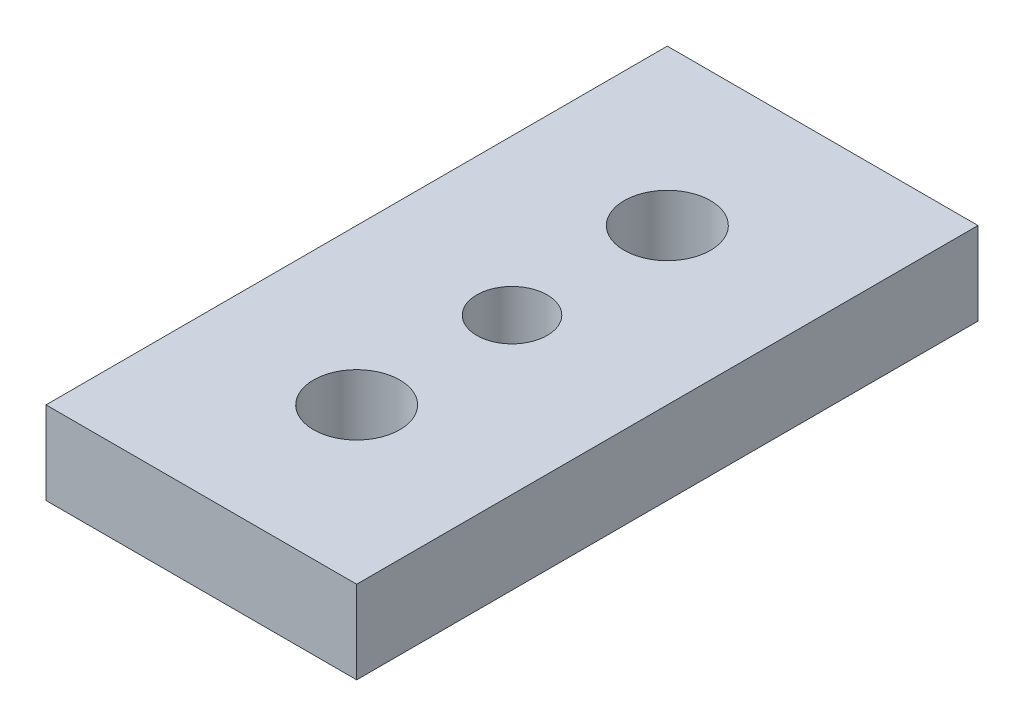
ISO-10303-21;
HEADER;
FILE_DESCRIPTION(('STEP AP214'),'2;1');
FILE_NAME('part.step','',(''),(''),'','','');
FILE_SCHEMA(('AUTOMOTIVE_DESIGN { 1 0 10303 214 1 1 1 1 }'));
ENDSEC;
DATA;
#1=APPLICATION_CONTEXT('core data for automotive mechanical design processes');
#2=APPLICATION_PROTOCOL_DEFINITION('international standard','automotive_design',2000,#1);
#3=PRODUCT_CONTEXT('',#1,'mechanical');
#4=PRODUCT('Part','Part','',(#3));
#5=PRODUCT_RELATED_PRODUCT_CATEGORY('part','',(#4));
#6=PRODUCT_DEFINITION_FORMATION('','',#4);
#7=PRODUCT_DEFINITION_CONTEXT('part definition',#1,'design');
#8=PRODUCT_DEFINITION('design','',#6,#7);
#9=PRODUCT_DEFINITION_SHAPE('','',#8);
#10=(LENGTH_UNIT() NAMED_UNIT(*) SI_UNIT(.MILLI.,.METRE.));
#11=(NAMED_UNIT(*) PLANE_ANGLE_UNIT() SI_UNIT($,.RADIAN.));
#12=(NAMED_UNIT(*) SI_UNIT($,.STERADIAN.) SOLID_ANGLE_UNIT());
#13=UNCERTAINTY_MEASURE_WITH_UNIT(LENGTH_MEASURE(1.E-05),#10,'distance_accuracy_value','');
#14=(GEOMETRIC_REPRESENTATION_CONTEXT(3) GLOBAL_UNCERTAINTY_ASSIGNED_CONTEXT((#13)) GLOBAL_UNIT_ASSIGNED_CONTEXT((#10,
#11,#12)) REPRESENTATION_CONTEXT('',''));
#15=CARTESIAN_POINT('',(0.,0.,0.));
#16=DIRECTION('',(0.,0.,1.));
#17=DIRECTION('',(1.,0.,0.));
#18=AXIS2_PLACEMENT_3D('',#15,#16,#17);
#19=CARTESIAN_POINT('',(0.,12.,0.));
#20=DIRECTION('',(0.,1.,0.));
#21=DIRECTION('',(0.,0.,1.));
#22=AXIS2_PLACEMENT_3D('',#19,#20,#21);
#23=PLANE('',#22);
#24=CARTESIAN_POINT('',(22.5,12.,-45.));
#25=DIRECTION('',(0.,1.,0.));
#26=DIRECTION('',(0.,0.,1.));
#27=AXIS2_PLACEMENT_3D('',#24,#25,#26);
#28=CIRCLE('',#27,5.1);
#29=CARTESIAN_POINT('',(22.5,12.,-39.9));
#30=VERTEX_POINT('',#29);
#31=EDGE_CURVE('E129',#30,#30,#28,.T.);
#32=ORIENTED_EDGE('',*,*,#31,.F.);
#33=EDGE_LOOP('',(#32));
#34=FACE_BOUND('',#33,.T.);
#35=CARTESIAN_POINT('',(22.5,12.,-67.5));
#36=DIRECTION('',(0.,1.,0.));
#37=DIRECTION('',(0.,0.,1.));
#38=AXIS2_PLACEMENT_3D('',#35,#36,#37);
#39=CIRCLE('',#38,6.25);
#40=CARTESIAN_POINT('',(22.5,12.,-61.25));
#41=VERTEX_POINT('',#40);
#42=EDGE_CURVE('E103',#41,#41,#39,.T.);
#43=ORIENTED_EDGE('',*,*,#42,.F.);
#44=EDGE_LOOP('',(#43));
#45=FACE_BOUND('',#44,.T.);
#46=DIRECTION('',(0.,0.,1.));
#47=VECTOR('',#46,1.);
#48=CARTESIAN_POINT('',(0.,12.,-90.));
#49=LINE('',#48,#47);
#50=CARTESIAN_POINT('',(0.,12.,-90.));
#51=VERTEX_POINT('',#50);
#52=CARTESIAN_POINT('',(0.,12.,0.));
#53=VERTEX_POINT('',#52);
#54=EDGE_CURVE('E88',#51,#53,#49,.T.);
#55=ORIENTED_EDGE('',*,*,#54,.T.);
#56=DIRECTION('',(1.,0.,0.));
#57=VECTOR('',#56,1.);
#58=CARTESIAN_POINT('',(0.,12.,0.));
#59=LINE('',#58,#57);
#60=CARTESIAN_POINT('',(45.,12.,0.));
#61=VERTEX_POINT('',#60);
#62=EDGE_CURVE('E83',#53,#61,#59,.T.);
#63=ORIENTED_EDGE('',*,*,#62,.T.);
#64=DIRECTION('',(0.,0.,-1.));
#65=VECTOR('',#64,1.);
#66=CARTESIAN_POINT('',(45.,12.,0.));
#67=LINE('',#66,#65);
#68=CARTESIAN_POINT('',(45.,12.,-90.));
#69=VERTEX_POINT('',#68);
#70=EDGE_CURVE('E86',#61,#69,#67,.T.);
#71=ORIENTED_EDGE('',*,*,#70,.T.);
#72=DIRECTION('',(-1.,0.,0.));
#73=VECTOR('',#72,1.);
#74=CARTESIAN_POINT('',(45.,12.,-90.));
#75=LINE('',#74,#73);
#76=EDGE_CURVE('E53',#69,#51,#75,.T.);
#77=ORIENTED_EDGE('',*,*,#76,.T.);
#78=EDGE_LOOP('',(#55,#63,#71,#77));
#79=FACE_BOUND('',#78,.T.);
#80=CARTESIAN_POINT('',(22.5,12.,-22.5));
#81=DIRECTION('',(0.,1.,0.));
#82=DIRECTION('',(0.,0.,1.));
#83=AXIS2_PLACEMENT_3D('',#80,#81,#82);
#84=CIRCLE('',#83,6.25);
#85=CARTESIAN_POINT('',(22.5,12.,-16.25));
#86=VERTEX_POINT('',#85);
#87=EDGE_CURVE('E118',#86,#86,#84,.T.);
#88=ORIENTED_EDGE('',*,*,#87,.F.);
#89=EDGE_LOOP('',(#88));
#90=FACE_BOUND('',#89,.T.);
#91=ADVANCED_FACE('F36',(#34,#45,#79,#90),#23,.T.);
#92=CARTESIAN_POINT('',(0.,0.,0.));
#93=DIRECTION('',(0.,1.,0.));
#94=DIRECTION('',(0.,0.,1.));
#95=AXIS2_PLACEMENT_3D('',#92,#93,#94);
#96=PLANE('',#95);
#97=CARTESIAN_POINT('',(22.5,0.,-45.));
#98=DIRECTION('',(0.,1.,0.));
#99=DIRECTION('',(0.,0.,1.));
#100=AXIS2_PLACEMENT_3D('',#97,#98,#99);
#101=CIRCLE('',#100,5.1);
#102=CARTESIAN_POINT('',(22.5,0.,-39.9));
#103=VERTEX_POINT('',#102);
#104=EDGE_CURVE('E124',#103,#103,#101,.T.);
#105=ORIENTED_EDGE('',*,*,#104,.T.);
#106=EDGE_LOOP('',(#105));
#107=FACE_BOUND('',#106,.T.);
#108=CARTESIAN_POINT('',(22.5,0.,-67.5));
#109=DIRECTION('',(0.,1.,0.));
#110=DIRECTION('',(0.,0.,1.));
#111=AXIS2_PLACEMENT_3D('',#108,#109,#110);
#112=CIRCLE('',#111,6.25);
#113=CARTESIAN_POINT('',(22.5,0.,-61.25));
#114=VERTEX_POINT('',#113);
#115=EDGE_CURVE('E115',#114,#114,#112,.T.);
#116=ORIENTED_EDGE('',*,*,#115,.T.);
#117=EDGE_LOOP('',(#116));
#118=FACE_BOUND('',#117,.T.);
#119=DIRECTION('',(0.,0.,1.));
#120=VECTOR('',#119,1.);
#121=CARTESIAN_POINT('',(0.,0.,-90.));
#122=LINE('',#121,#120);
#123=CARTESIAN_POINT('',(0.,0.,-90.));
#124=VERTEX_POINT('',#123);
#125=CARTESIAN_POINT('',(0.,0.,0.));
#126=VERTEX_POINT('',#125);
#127=EDGE_CURVE('E100',#124,#126,#122,.T.);
#128=ORIENTED_EDGE('',*,*,#127,.F.);
#129=DIRECTION('',(-1.,0.,0.));
#130=VECTOR('',#129,1.);
#131=CARTESIAN_POINT('',(45.,0.,-90.));
#132=LINE('',#131,#130);
#133=CARTESIAN_POINT('',(45.,0.,-90.));
#134=VERTEX_POINT('',#133);
#135=EDGE_CURVE('E76',#134,#124,#132,.T.);
#136=ORIENTED_EDGE('',*,*,#135,.F.);
#137=DIRECTION('',(0.,0.,-1.));
#138=VECTOR('',#137,1.);
#139=CARTESIAN_POINT('',(45.,0.,0.));
#140=LINE('',#139,#138);
#141=CARTESIAN_POINT('',(45.,0.,0.));
#142=VERTEX_POINT('',#141);
#143=EDGE_CURVE('E70',#142,#134,#140,.T.);
#144=ORIENTED_EDGE('',*,*,#143,.F.);
#145=DIRECTION('',(1.,0.,0.));
#146=VECTOR('',#145,1.);
#147=CARTESIAN_POINT('',(0.,0.,0.));
#148=LINE('',#147,#146);
#149=EDGE_CURVE('E92',#126,#142,#148,.T.);
#150=ORIENTED_EDGE('',*,*,#149,.F.);
#151=EDGE_LOOP('',(#128,#136,#144,#150));
#152=FACE_BOUND('',#151,.T.);
#153=CARTESIAN_POINT('',(22.5,0.,-22.5));
#154=DIRECTION('',(0.,1.,0.));
#155=DIRECTION('',(0.,0.,1.));
#156=AXIS2_PLACEMENT_3D('',#153,#154,#155);
#157=CIRCLE('',#156,6.25);
#158=CARTESIAN_POINT('',(22.5,0.,-16.25));
#159=VERTEX_POINT('',#158);
#160=EDGE_CURVE('E121',#159,#159,#157,.T.);
#161=ORIENTED_EDGE('',*,*,#160,.T.);
#162=EDGE_LOOP('',(#161));
#163=FACE_BOUND('',#162,.T.);
#164=ADVANCED_FACE('F111',(#107,#118,#152,#163),#96,.F.);
#165=CARTESIAN_POINT('',(0.,12.,-90.));
#166=DIRECTION('',(1.,0.,0.));
#167=DIRECTION('',(0.,0.,-1.));
#168=AXIS2_PLACEMENT_3D('',#165,#166,#167);
#169=PLANE('',#168);
#170=ORIENTED_EDGE('',*,*,#127,.T.);
#171=DIRECTION('',(0.,-1.,0.));
#172=VECTOR('',#171,1.);
#173=CARTESIAN_POINT('',(0.,12.,0.));
#174=LINE('',#173,#172);
#175=EDGE_CURVE('E11',#53,#126,#174,.T.);
#176=ORIENTED_EDGE('',*,*,#175,.F.);
#177=ORIENTED_EDGE('',*,*,#54,.F.);
#178=DIRECTION('',(0.,-1.,0.));
#179=VECTOR('',#178,1.);
#180=CARTESIAN_POINT('',(0.,12.,-90.));
#181=LINE('',#180,#179);
#182=EDGE_CURVE('E96',#51,#124,#181,.T.);
#183=ORIENTED_EDGE('',*,*,#182,.T.);
#184=EDGE_LOOP('',(#170,#176,#177,#183));
#185=FACE_BOUND('',#184,.T.);
#186=ADVANCED_FACE('F38',(#185),#169,.F.);
#187=CARTESIAN_POINT('',(0.,12.,0.));
#188=DIRECTION('',(0.,0.,-1.));
#189=DIRECTION('',(-1.,0.,0.));
#190=AXIS2_PLACEMENT_3D('',#187,#188,#189);
#191=PLANE('',#190);
#192=ORIENTED_EDGE('',*,*,#149,.T.);
#193=DIRECTION('',(0.,-1.,0.));
#194=VECTOR('',#193,1.);
#195=CARTESIAN_POINT('',(45.,12.,0.));
#196=LINE('',#195,#194);
#197=EDGE_CURVE('E45',#61,#142,#196,.T.);
#198=ORIENTED_EDGE('',*,*,#197,.F.);
#199=ORIENTED_EDGE('',*,*,#62,.F.);
#200=ORIENTED_EDGE('',*,*,#175,.T.);
#201=EDGE_LOOP('',(#192,#198,#199,#200));
#202=FACE_BOUND('',#201,.T.);
#203=ADVANCED_FACE('F91',(#202),#191,.F.);
#204=CARTESIAN_POINT('',(45.,12.,0.));
#205=DIRECTION('',(-1.,0.,0.));
#206=DIRECTION('',(0.,0.,1.));
#207=AXIS2_PLACEMENT_3D('',#204,#205,#206);
#208=PLANE('',#207);
#209=ORIENTED_EDGE('',*,*,#143,.T.);
#210=DIRECTION('',(0.,-1.,0.));
#211=VECTOR('',#210,1.);
#212=CARTESIAN_POINT('',(45.,12.,-90.));
#213=LINE('',#212,#211);
#214=EDGE_CURVE('E93',#69,#134,#213,.T.);
#215=ORIENTED_EDGE('',*,*,#214,.F.);
#216=ORIENTED_EDGE('',*,*,#70,.F.);
#217=ORIENTED_EDGE('',*,*,#197,.T.);
#218=EDGE_LOOP('',(#209,#215,#216,#217));
#219=FACE_BOUND('',#218,.T.);
#220=ADVANCED_FACE('F94',(#219),#208,.F.);
#221=CARTESIAN_POINT('',(45.,12.,-90.));
#222=DIRECTION('',(0.,0.,1.));
#223=DIRECTION('',(1.,0.,0.));
#224=AXIS2_PLACEMENT_3D('',#221,#222,#223);
#225=PLANE('',#224);
#226=ORIENTED_EDGE('',*,*,#135,.T.);
#227=ORIENTED_EDGE('',*,*,#182,.F.);
#228=ORIENTED_EDGE('',*,*,#76,.F.);
#229=ORIENTED_EDGE('',*,*,#214,.T.);
#230=EDGE_LOOP('',(#226,#227,#228,#229));
#231=FACE_BOUND('',#230,.T.);
#232=ADVANCED_FACE('F108',(#231),#225,.F.);
#233=CARTESIAN_POINT('',(22.5,12.,-67.5));
#234=DIRECTION('',(0.,-1.,0.));
#235=DIRECTION('',(0.,0.,-1.));
#236=AXIS2_PLACEMENT_3D('',#233,#234,#235);
#237=CYLINDRICAL_SURFACE('',#236,6.25);
#238=ORIENTED_EDGE('',*,*,#42,.T.);
#239=EDGE_LOOP('',(#238));
#240=FACE_BOUND('',#239,.T.);
#241=ORIENTED_EDGE('',*,*,#115,.F.);
#242=EDGE_LOOP('',(#241));
#243=FACE_BOUND('',#242,.T.);
#244=ADVANCED_FACE('F141',(#240,#243),#237,.F.);
#245=CARTESIAN_POINT('',(22.5,12.,-22.5));
#246=DIRECTION('',(0.,-1.,0.));
#247=DIRECTION('',(0.,0.,-1.));
#248=AXIS2_PLACEMENT_3D('',#245,#246,#247);
#249=CYLINDRICAL_SURFACE('',#248,6.25);
#250=ORIENTED_EDGE('',*,*,#87,.T.);
#251=EDGE_LOOP('',(#250));
#252=FACE_BOUND('',#251,.T.);
#253=ORIENTED_EDGE('',*,*,#160,.F.);
#254=EDGE_LOOP('',(#253));
#255=FACE_BOUND('',#254,.T.);
#256=ADVANCED_FACE('F144',(#252,#255),#249,.F.);
#257=CARTESIAN_POINT('',(22.5,12.,-45.));
#258=DIRECTION('',(0.,1.,0.));
#259=DIRECTION('',(0.,0.,1.));
#260=AXIS2_PLACEMENT_3D('',#257,#258,#259);
#261=CYLINDRICAL_SURFACE('',#260,5.1);
#262=ORIENTED_EDGE('',*,*,#31,.T.);
#263=EDGE_LOOP('',(#262));
#264=FACE_BOUND('',#263,.T.);
#265=ORIENTED_EDGE('',*,*,#104,.F.);
#266=EDGE_LOOP('',(#265));
#267=FACE_BOUND('',#266,.T.);
#268=ADVANCED_FACE('F133',(#264,#267),#261,.F.);
#269=CLOSED_SHELL('',(#91,#164,#186,#203,#220,#232,#244,#256,#268));
#270=MANIFOLD_SOLID_BREP('B2',#269);
#271=ADVANCED_BREP_SHAPE_REPRESENTATION('',(#18,#270),#14);
#272=SHAPE_DEFINITION_REPRESENTATION(#9,#271);
ENDSEC;
END-ISO-10303-21;
